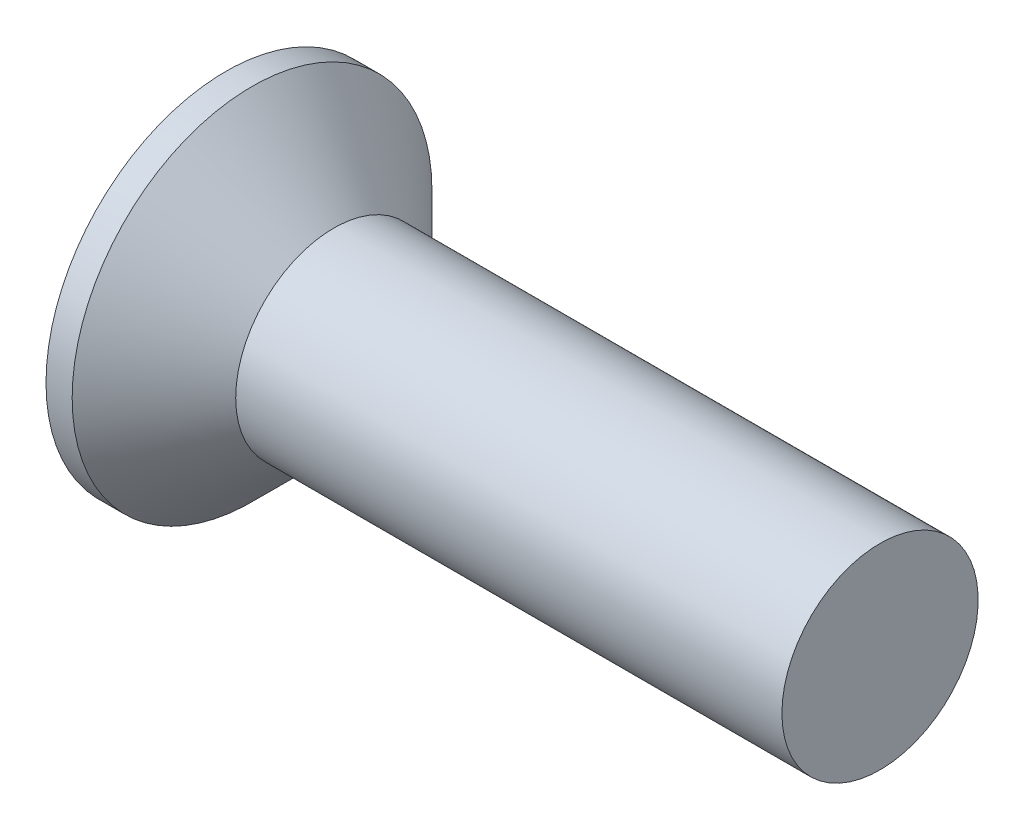
ISO-10303-21;
HEADER;
FILE_DESCRIPTION(('STEP AP214'),'2;1');
FILE_NAME('part.step','',(''),(''),'','','');
FILE_SCHEMA(('AUTOMOTIVE_DESIGN { 1 0 10303 214 1 1 1 1 }'));
ENDSEC;
DATA;
#1=APPLICATION_CONTEXT('core data for automotive mechanical design processes');
#2=APPLICATION_PROTOCOL_DEFINITION('international standard','automotive_design',2000,#1);
#3=PRODUCT_CONTEXT('',#1,'mechanical');
#4=PRODUCT('Part','Part','',(#3));
#5=PRODUCT_RELATED_PRODUCT_CATEGORY('part','',(#4));
#6=PRODUCT_DEFINITION_FORMATION('','',#4);
#7=PRODUCT_DEFINITION_CONTEXT('part definition',#1,'design');
#8=PRODUCT_DEFINITION('design','',#6,#7);
#9=PRODUCT_DEFINITION_SHAPE('','',#8);
#10=(LENGTH_UNIT() NAMED_UNIT(*) SI_UNIT(.MILLI.,.METRE.));
#11=(NAMED_UNIT(*) PLANE_ANGLE_UNIT() SI_UNIT($,.RADIAN.));
#12=(NAMED_UNIT(*) SI_UNIT($,.STERADIAN.) SOLID_ANGLE_UNIT());
#13=UNCERTAINTY_MEASURE_WITH_UNIT(LENGTH_MEASURE(1.E-05),#10,'distance_accuracy_value','');
#14=(GEOMETRIC_REPRESENTATION_CONTEXT(3) GLOBAL_UNCERTAINTY_ASSIGNED_CONTEXT((#13)) GLOBAL_UNIT_ASSIGNED_CONTEXT((#10,
#11,#12)) REPRESENTATION_CONTEXT('',''));
#15=CARTESIAN_POINT('',(0.,0.,0.));
#16=DIRECTION('',(0.,0.,1.));
#17=DIRECTION('',(1.,0.,0.));
#18=AXIS2_PLACEMENT_3D('',#15,#16,#17);
#19=CARTESIAN_POINT('',(0.,2.75,0.));
#20=DIRECTION('',(1.,0.,0.));
#21=DIRECTION('',(0.,0.,-1.));
#22=AXIS2_PLACEMENT_3D('',#19,#20,#21);
#23=PLANE('',#22);
#24=CARTESIAN_POINT('',(0.,0.,0.));
#25=DIRECTION('',(-1.,0.,0.));
#26=DIRECTION('',(0.,0.,1.));
#27=AXIS2_PLACEMENT_3D('',#24,#25,#26);
#28=CIRCLE('',#27,2.75);
#29=CARTESIAN_POINT('',(0.,0.,2.75));
#30=VERTEX_POINT('',#29);
#31=EDGE_CURVE('E45',#30,#30,#28,.T.);
#32=ORIENTED_EDGE('',*,*,#31,.T.);
#33=EDGE_LOOP('',(#32));
#34=FACE_BOUND('',#33,.T.);
#35=ADVANCED_FACE('F31',(#34),#23,.F.);
#36=CARTESIAN_POINT('',(10.,0.,0.));
#37=DIRECTION('',(-1.,0.,0.));
#38=DIRECTION('',(0.,0.,1.));
#39=AXIS2_PLACEMENT_3D('',#36,#37,#38);
#40=PLANE('',#39);
#41=CARTESIAN_POINT('',(10.,0.,0.));
#42=DIRECTION('',(-1.,0.,0.));
#43=DIRECTION('',(0.,0.,1.));
#44=AXIS2_PLACEMENT_3D('',#41,#42,#43);
#45=CIRCLE('',#44,1.5);
#46=CARTESIAN_POINT('',(10.,0.,1.5));
#47=VERTEX_POINT('',#46);
#48=EDGE_CURVE('E10',#47,#47,#45,.T.);
#49=ORIENTED_EDGE('',*,*,#48,.F.);
#50=EDGE_LOOP('',(#49));
#51=FACE_BOUND('',#50,.T.);
#52=ADVANCED_FACE('F65',(#51),#40,.F.);
#53=CARTESIAN_POINT('',(0.,0.,0.));
#54=DIRECTION('',(-1.,0.,0.));
#55=DIRECTION('',(0.,0.,1.));
#56=AXIS2_PLACEMENT_3D('',#53,#54,#55);
#57=CYLINDRICAL_SURFACE('',#56,1.5);
#58=CARTESIAN_POINT('',(1.65,0.,0.));
#59=DIRECTION('',(-1.,0.,0.));
#60=DIRECTION('',(0.,0.,1.));
#61=AXIS2_PLACEMENT_3D('',#58,#59,#60);
#62=CIRCLE('',#61,1.5);
#63=CARTESIAN_POINT('',(1.65,0.,1.5));
#64=VERTEX_POINT('',#63);
#65=EDGE_CURVE('E37',#64,#64,#62,.T.);
#66=ORIENTED_EDGE('',*,*,#65,.F.);
#67=EDGE_LOOP('',(#66));
#68=FACE_BOUND('',#67,.T.);
#69=ORIENTED_EDGE('',*,*,#48,.T.);
#70=EDGE_LOOP('',(#69));
#71=FACE_BOUND('',#70,.T.);
#72=ADVANCED_FACE('F60',(#68,#71),#57,.T.);
#73=CARTESIAN_POINT('',(1.65,0.,0.));
#74=DIRECTION('',(-1.,0.,0.));
#75=DIRECTION('',(0.,0.,1.));
#76=AXIS2_PLACEMENT_3D('',#73,#74,#75);
#77=CONICAL_SURFACE('',#76,1.5,0.78539816339745);
#78=CARTESIAN_POINT('',(0.400000000000003,0.,0.));
#79=DIRECTION('',(-1.,0.,0.));
#80=DIRECTION('',(0.,0.,1.));
#81=AXIS2_PLACEMENT_3D('',#78,#79,#80);
#82=CIRCLE('',#81,2.75);
#83=CARTESIAN_POINT('',(0.400000000000003,0.,2.75));
#84=VERTEX_POINT('',#83);
#85=EDGE_CURVE('E41',#84,#84,#82,.T.);
#86=ORIENTED_EDGE('',*,*,#85,.F.);
#87=EDGE_LOOP('',(#86));
#88=FACE_BOUND('',#87,.T.);
#89=ORIENTED_EDGE('',*,*,#65,.T.);
#90=EDGE_LOOP('',(#89));
#91=FACE_BOUND('',#90,.T.);
#92=ADVANCED_FACE('F55',(#88,#91),#77,.T.);
#93=CARTESIAN_POINT('',(0.,0.,0.));
#94=DIRECTION('',(-1.,0.,0.));
#95=DIRECTION('',(0.,0.,1.));
#96=AXIS2_PLACEMENT_3D('',#93,#94,#95);
#97=CYLINDRICAL_SURFACE('',#96,2.75);
#98=ORIENTED_EDGE('',*,*,#31,.F.);
#99=EDGE_LOOP('',(#98));
#100=FACE_BOUND('',#99,.T.);
#101=ORIENTED_EDGE('',*,*,#85,.T.);
#102=EDGE_LOOP('',(#101));
#103=FACE_BOUND('',#102,.T.);
#104=ADVANCED_FACE('F52',(#100,#103),#97,.T.);
#105=CLOSED_SHELL('',(#35,#52,#72,#92,#104));
#106=MANIFOLD_SOLID_BREP('B2',#105);
#107=ADVANCED_BREP_SHAPE_REPRESENTATION('',(#18,#106),#14);
#108=SHAPE_DEFINITION_REPRESENTATION(#9,#107);
ENDSEC;
END-ISO-10303-21;
